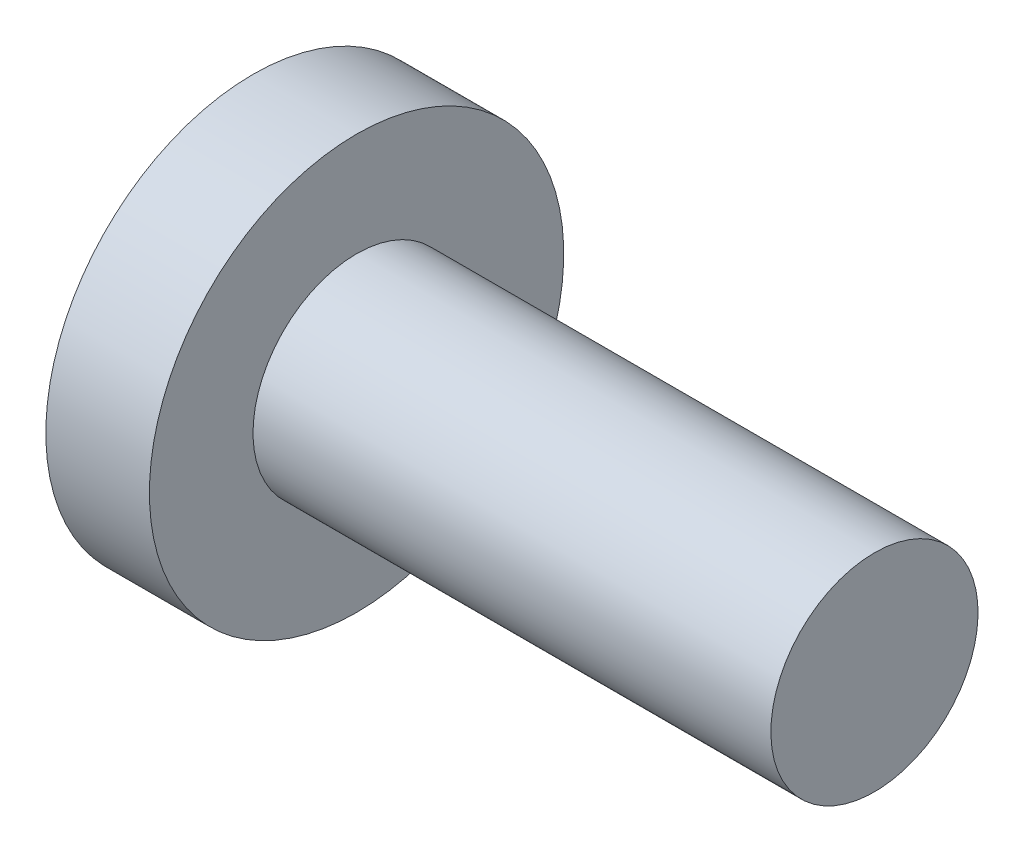
ISO-10303-21;
HEADER;
FILE_DESCRIPTION(('STEP AP214'),'2;1');
FILE_NAME('part.step','',(''),(''),'','','');
FILE_SCHEMA(('AUTOMOTIVE_DESIGN { 1 0 10303 214 1 1 1 1 }'));
ENDSEC;
DATA;
#1=APPLICATION_CONTEXT('core data for automotive mechanical design processes');
#2=APPLICATION_PROTOCOL_DEFINITION('international standard','automotive_design',2000,#1);
#3=PRODUCT_CONTEXT('',#1,'mechanical');
#4=PRODUCT('Part','Part','',(#3));
#5=PRODUCT_RELATED_PRODUCT_CATEGORY('part','',(#4));
#6=PRODUCT_DEFINITION_FORMATION('','',#4);
#7=PRODUCT_DEFINITION_CONTEXT('part definition',#1,'design');
#8=PRODUCT_DEFINITION('design','',#6,#7);
#9=PRODUCT_DEFINITION_SHAPE('','',#8);
#10=(LENGTH_UNIT() NAMED_UNIT(*) SI_UNIT(.MILLI.,.METRE.));
#11=(NAMED_UNIT(*) PLANE_ANGLE_UNIT() SI_UNIT($,.RADIAN.));
#12=(NAMED_UNIT(*) SI_UNIT($,.STERADIAN.) SOLID_ANGLE_UNIT());
#13=UNCERTAINTY_MEASURE_WITH_UNIT(LENGTH_MEASURE(1.E-05),#10,'distance_accuracy_value','');
#14=(GEOMETRIC_REPRESENTATION_CONTEXT(3) GLOBAL_UNCERTAINTY_ASSIGNED_CONTEXT((#13)) GLOBAL_UNIT_ASSIGNED_CONTEXT((#10,
#11,#12)) REPRESENTATION_CONTEXT('',''));
#15=CARTESIAN_POINT('',(0.,0.,0.));
#16=DIRECTION('',(0.,0.,1.));
#17=DIRECTION('',(1.,0.,0.));
#18=AXIS2_PLACEMENT_3D('',#15,#16,#17);
#19=CARTESIAN_POINT('',(0.,-2.,0.));
#20=DIRECTION('',(-1.,0.,0.));
#21=DIRECTION('',(0.,-1.,0.));
#22=AXIS2_PLACEMENT_3D('',#19,#20,#21);
#23=PLANE('',#22);
#24=CARTESIAN_POINT('',(0.,-2.,0.));
#25=DIRECTION('',(1.,0.,0.));
#26=DIRECTION('',(0.,1.,0.));
#27=AXIS2_PLACEMENT_3D('',#24,#25,#26);
#28=CIRCLE('',#27,2.);
#29=CARTESIAN_POINT('',(0.,0.,0.));
#30=VERTEX_POINT('',#29);
#31=EDGE_CURVE('E10',#30,#30,#28,.T.);
#32=ORIENTED_EDGE('',*,*,#31,.F.);
#33=EDGE_LOOP('',(#32));
#34=FACE_BOUND('',#33,.T.);
#35=ADVANCED_FACE('F37',(#34),#23,.T.);
#36=CARTESIAN_POINT('',(6.,-2.,0.));
#37=DIRECTION('',(1.,0.,0.));
#38=DIRECTION('',(0.,1.,0.));
#39=AXIS2_PLACEMENT_3D('',#36,#37,#38);
#40=CYLINDRICAL_SURFACE('',#39,2.);
#41=ORIENTED_EDGE('',*,*,#31,.T.);
#42=EDGE_LOOP('',(#41));
#43=FACE_BOUND('',#42,.T.);
#44=CARTESIAN_POINT('',(1.,-2.,0.));
#45=DIRECTION('',(1.,0.,0.));
#46=DIRECTION('',(0.,1.,0.));
#47=AXIS2_PLACEMENT_3D('',#44,#45,#46);
#48=CIRCLE('',#47,2.);
#49=CARTESIAN_POINT('',(1.,0.,0.));
#50=VERTEX_POINT('',#49);
#51=EDGE_CURVE('E44',#50,#50,#48,.T.);
#52=ORIENTED_EDGE('',*,*,#51,.F.);
#53=EDGE_LOOP('',(#52));
#54=FACE_BOUND('',#53,.T.);
#55=ADVANCED_FACE('F73',(#43,#54),#40,.T.);
#56=CARTESIAN_POINT('',(1.,0.,0.));
#57=DIRECTION('',(1.,0.,0.));
#58=DIRECTION('',(0.,1.,0.));
#59=AXIS2_PLACEMENT_3D('',#56,#57,#58);
#60=PLANE('',#59);
#61=ORIENTED_EDGE('',*,*,#51,.T.);
#62=EDGE_LOOP('',(#61));
#63=FACE_BOUND('',#62,.T.);
#64=CARTESIAN_POINT('',(1.,-2.,0.));
#65=DIRECTION('',(1.,0.,0.));
#66=DIRECTION('',(0.,1.,0.));
#67=AXIS2_PLACEMENT_3D('',#64,#65,#66);
#68=CIRCLE('',#67,1.);
#69=CARTESIAN_POINT('',(1.,-1.,0.));
#70=VERTEX_POINT('',#69);
#71=EDGE_CURVE('E49',#70,#70,#68,.T.);
#72=ORIENTED_EDGE('',*,*,#71,.F.);
#73=EDGE_LOOP('',(#72));
#74=FACE_BOUND('',#73,.T.);
#75=ADVANCED_FACE('F65',(#63,#74),#60,.T.);
#76=CARTESIAN_POINT('',(6.,-2.,0.));
#77=DIRECTION('',(1.,0.,0.));
#78=DIRECTION('',(0.,1.,0.));
#79=AXIS2_PLACEMENT_3D('',#76,#77,#78);
#80=CYLINDRICAL_SURFACE('',#79,1.);
#81=ORIENTED_EDGE('',*,*,#71,.T.);
#82=EDGE_LOOP('',(#81));
#83=FACE_BOUND('',#82,.T.);
#84=CARTESIAN_POINT('',(6.,-2.,0.));
#85=DIRECTION('',(1.,0.,0.));
#86=DIRECTION('',(0.,1.,0.));
#87=AXIS2_PLACEMENT_3D('',#84,#85,#86);
#88=CIRCLE('',#87,1.);
#89=CARTESIAN_POINT('',(6.,-0.999999999999999,0.));
#90=VERTEX_POINT('',#89);
#91=EDGE_CURVE('E54',#90,#90,#88,.T.);
#92=ORIENTED_EDGE('',*,*,#91,.F.);
#93=EDGE_LOOP('',(#92));
#94=FACE_BOUND('',#93,.T.);
#95=ADVANCED_FACE('F63',(#83,#94),#80,.T.);
#96=CARTESIAN_POINT('',(6.,-0.999999999999999,0.));
#97=DIRECTION('',(1.,0.,0.));
#98=DIRECTION('',(0.,1.,0.));
#99=AXIS2_PLACEMENT_3D('',#96,#97,#98);
#100=PLANE('',#99);
#101=ORIENTED_EDGE('',*,*,#91,.T.);
#102=EDGE_LOOP('',(#101));
#103=FACE_BOUND('',#102,.T.);
#104=ADVANCED_FACE('F61',(#103),#100,.T.);
#105=CLOSED_SHELL('',(#35,#55,#75,#95,#104));
#106=MANIFOLD_SOLID_BREP('B2',#105);
#107=ADVANCED_BREP_SHAPE_REPRESENTATION('',(#18,#106),#14);
#108=SHAPE_DEFINITION_REPRESENTATION(#9,#107);
ENDSEC;
END-ISO-10303-21;
